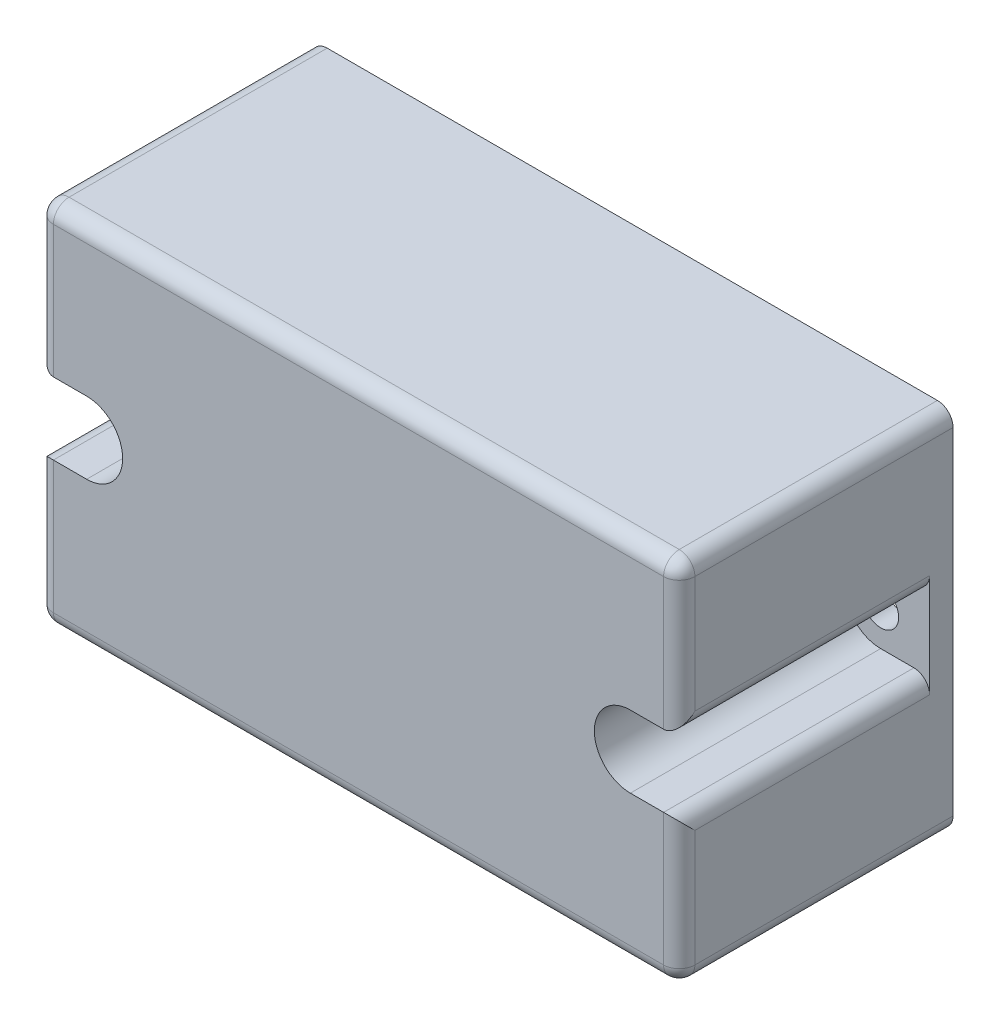
ISO-10303-21;
HEADER;
FILE_DESCRIPTION(('STEP AP214'),'2;1');
FILE_NAME('part.step','',(''),(''),'','','');
FILE_SCHEMA(('AUTOMOTIVE_DESIGN { 1 0 10303 214 1 1 1 1 }'));
ENDSEC;
DATA;
#1=APPLICATION_CONTEXT('core data for automotive mechanical design processes');
#2=APPLICATION_PROTOCOL_DEFINITION('international standard','automotive_design',2000,#1);
#3=PRODUCT_CONTEXT('',#1,'mechanical');
#4=PRODUCT('Part','Part','',(#3));
#5=PRODUCT_RELATED_PRODUCT_CATEGORY('part','',(#4));
#6=PRODUCT_DEFINITION_FORMATION('','',#4);
#7=PRODUCT_DEFINITION_CONTEXT('part definition',#1,'design');
#8=PRODUCT_DEFINITION('design','',#6,#7);
#9=PRODUCT_DEFINITION_SHAPE('','',#8);
#10=(LENGTH_UNIT() NAMED_UNIT(*) SI_UNIT(.MILLI.,.METRE.));
#11=(NAMED_UNIT(*) PLANE_ANGLE_UNIT() SI_UNIT($,.RADIAN.));
#12=(NAMED_UNIT(*) SI_UNIT($,.STERADIAN.) SOLID_ANGLE_UNIT());
#13=UNCERTAINTY_MEASURE_WITH_UNIT(LENGTH_MEASURE(1.E-05),#10,'distance_accuracy_value','');
#14=(GEOMETRIC_REPRESENTATION_CONTEXT(3) GLOBAL_UNCERTAINTY_ASSIGNED_CONTEXT((#13)) GLOBAL_UNIT_ASSIGNED_CONTEXT((#10,
#11,#12)) REPRESENTATION_CONTEXT('',''));
#15=CARTESIAN_POINT('',(0.,0.,0.));
#16=DIRECTION('',(0.,0.,1.));
#17=DIRECTION('',(1.,0.,0.));
#18=AXIS2_PLACEMENT_3D('',#15,#16,#17);
#19=CARTESIAN_POINT('',(24.9640494347916,-18.1546831961727,35.));
#20=DIRECTION('',(0.,0.,1.));
#21=DIRECTION('',(1.,0.,0.));
#22=AXIS2_PLACEMENT_3D('',#19,#20,#21);
#23=PLANE('',#22);
#24=CARTESIAN_POINT('',(-9.78595056520844,-18.1546831961727,35.));
#25=DIRECTION('',(0.,0.,-1.));
#26=DIRECTION('',(-1.,0.,0.));
#27=AXIS2_PLACEMENT_3D('',#24,#25,#26);
#28=CIRCLE('',#27,4.6);
#29=CARTESIAN_POINT('',(-9.78595056520844,-13.5546831961727,35.));
#30=VERTEX_POINT('',#29);
#31=CARTESIAN_POINT('',(-9.78595056520843,-22.7546831961727,35.));
#32=VERTEX_POINT('',#31);
#33=EDGE_CURVE('E182',#30,#32,#28,.T.);
#34=ORIENTED_EDGE('',*,*,#33,.T.);
#35=DIRECTION('',(1.,0.,0.));
#36=VECTOR('',#35,1.);
#37=CARTESIAN_POINT('',(-16.0359505652084,-22.7546831961727,35.));
#38=LINE('',#37,#36);
#39=CARTESIAN_POINT('',(-14.0359505652084,-22.7546831961727,35.));
#40=VERTEX_POINT('',#39);
#41=EDGE_CURVE('E158',#32,#40,#38,.F.);
#42=ORIENTED_EDGE('',*,*,#41,.T.);
#43=DIRECTION('',(0.,1.,0.));
#44=VECTOR('',#43,1.);
#45=CARTESIAN_POINT('',(-14.0359505652084,-29.9046831961727,35.));
#46=LINE('',#45,#44);
#47=CARTESIAN_POINT('',(-14.0359505652084,-39.6546831961727,35.));
#48=VERTEX_POINT('',#47);
#49=EDGE_CURVE('E242',#48,#40,#46,.T.);
#50=ORIENTED_EDGE('',*,*,#49,.F.);
#51=DIRECTION('',(-1.,0.,0.));
#52=VECTOR('',#51,1.);
#53=CARTESIAN_POINT('',(45.4640494347916,-39.6546831961727,35.));
#54=LINE('',#53,#52);
#55=CARTESIAN_POINT('',(63.9640494347916,-39.6546831961727,35.));
#56=VERTEX_POINT('',#55);
#57=EDGE_CURVE('E170',#56,#48,#54,.T.);
#58=ORIENTED_EDGE('',*,*,#57,.F.);
#59=DIRECTION('',(0.,-1.,0.));
#60=VECTOR('',#59,1.);
#61=CARTESIAN_POINT('',(63.9640494347916,-6.40468319617268,35.));
#62=LINE('',#61,#60);
#63=CARTESIAN_POINT('',(63.9640494347916,-22.7546831961727,35.));
#64=VERTEX_POINT('',#63);
#65=EDGE_CURVE('E516',#64,#56,#62,.T.);
#66=ORIENTED_EDGE('',*,*,#65,.F.);
#67=DIRECTION('',(1.,0.,0.));
#68=VECTOR('',#67,1.);
#69=CARTESIAN_POINT('',(59.7140494347916,-22.7546831961727,35.));
#70=LINE('',#69,#68);
#71=CARTESIAN_POINT('',(59.7140494347916,-22.7546831961727,35.));
#72=VERTEX_POINT('',#71);
#73=EDGE_CURVE('E151',#64,#72,#70,.F.);
#74=ORIENTED_EDGE('',*,*,#73,.T.);
#75=CARTESIAN_POINT('',(59.7140494347916,-18.1546831961727,35.));
#76=DIRECTION('',(0.,0.,-1.));
#77=DIRECTION('',(-1.,0.,0.));
#78=AXIS2_PLACEMENT_3D('',#75,#76,#77);
#79=CIRCLE('',#78,4.6);
#80=CARTESIAN_POINT('',(59.7140494347916,-13.5546831961727,35.));
#81=VERTEX_POINT('',#80);
#82=EDGE_CURVE('E20',#72,#81,#79,.T.);
#83=ORIENTED_EDGE('',*,*,#82,.T.);
#84=DIRECTION('',(1.,0.,0.));
#85=VECTOR('',#84,1.);
#86=CARTESIAN_POINT('',(65.9640494347916,-13.5546831961727,35.));
#87=LINE('',#86,#85);
#88=CARTESIAN_POINT('',(63.9640494347916,-13.5546831961727,35.));
#89=VERTEX_POINT('',#88);
#90=EDGE_CURVE('E148',#81,#89,#87,.T.);
#91=ORIENTED_EDGE('',*,*,#90,.T.);
#92=DIRECTION('',(0.,-1.,0.));
#93=VECTOR('',#92,1.);
#94=CARTESIAN_POINT('',(63.9640494347916,-6.40468319617268,35.));
#95=LINE('',#94,#93);
#96=CARTESIAN_POINT('',(63.9640494347916,3.34531680382732,35.));
#97=VERTEX_POINT('',#96);
#98=EDGE_CURVE('E250',#97,#89,#95,.T.);
#99=ORIENTED_EDGE('',*,*,#98,.F.);
#100=DIRECTION('',(1.,0.,0.));
#101=VECTOR('',#100,1.);
#102=CARTESIAN_POINT('',(4.46404943479156,3.34531680382732,35.));
#103=LINE('',#102,#101);
#104=CARTESIAN_POINT('',(-14.0359505652084,3.34531680382732,35.));
#105=VERTEX_POINT('',#104);
#106=EDGE_CURVE('E183',#105,#97,#103,.T.);
#107=ORIENTED_EDGE('',*,*,#106,.F.);
#108=DIRECTION('',(0.,1.,0.));
#109=VECTOR('',#108,1.);
#110=CARTESIAN_POINT('',(-14.0359505652084,-29.9046831961727,35.));
#111=LINE('',#110,#109);
#112=CARTESIAN_POINT('',(-14.0359505652084,-13.5546831961727,35.));
#113=VERTEX_POINT('',#112);
#114=EDGE_CURVE('E426',#113,#105,#111,.T.);
#115=ORIENTED_EDGE('',*,*,#114,.F.);
#116=DIRECTION('',(1.,0.,0.));
#117=VECTOR('',#116,1.);
#118=CARTESIAN_POINT('',(-9.78595056520844,-13.5546831961727,35.));
#119=LINE('',#118,#117);
#120=EDGE_CURVE('E177',#113,#30,#119,.T.);
#121=ORIENTED_EDGE('',*,*,#120,.T.);
#122=EDGE_LOOP('',(#34,#42,#50,#58,#66,#74,#83,#91,#99,#107,#115,#121));
#123=FACE_BOUND('',#122,.T.);
#124=ADVANCED_FACE('F17',(#123),#23,.T.);
#125=CARTESIAN_POINT('',(59.7140494347916,-18.1546831961727,35.));
#126=DIRECTION('',(0.,0.,-1.));
#127=DIRECTION('',(-1.,0.,0.));
#128=AXIS2_PLACEMENT_3D('',#125,#126,#127);
#129=CYLINDRICAL_SURFACE('',#128,4.6);
#130=DIRECTION('',(0.,0.,1.));
#131=VECTOR('',#130,1.);
#132=CARTESIAN_POINT('',(59.7140494347916,-13.5546831961727,35.));
#133=LINE('',#132,#131);
#134=CARTESIAN_POINT('',(59.7140494347916,-13.5546831961727,3.));
#135=VERTEX_POINT('',#134);
#136=EDGE_CURVE('E155',#135,#81,#133,.T.);
#137=ORIENTED_EDGE('',*,*,#136,.T.);
#138=ORIENTED_EDGE('',*,*,#82,.F.);
#139=DIRECTION('',(0.,0.,-1.));
#140=VECTOR('',#139,1.);
#141=CARTESIAN_POINT('',(59.7140494347916,-22.7546831961727,35.));
#142=LINE('',#141,#140);
#143=CARTESIAN_POINT('',(59.7140494347916,-22.7546831961727,3.));
#144=VERTEX_POINT('',#143);
#145=EDGE_CURVE('E163',#72,#144,#142,.T.);
#146=ORIENTED_EDGE('',*,*,#145,.T.);
#147=CARTESIAN_POINT('',(59.7140494347916,-18.1546831961727,3.));
#148=DIRECTION('',(0.,0.,-1.));
#149=DIRECTION('',(-1.,0.,0.));
#150=AXIS2_PLACEMENT_3D('',#147,#148,#149);
#151=CIRCLE('',#150,4.6);
#152=EDGE_CURVE('E162',#135,#144,#151,.F.);
#153=ORIENTED_EDGE('',*,*,#152,.F.);
#154=EDGE_LOOP('',(#137,#138,#146,#153));
#155=FACE_BOUND('',#154,.T.);
#156=ADVANCED_FACE('F161',(#155),#129,.F.);
#157=CARTESIAN_POINT('',(59.7140494347916,-22.7546831961727,35.));
#158=DIRECTION('',(0.,-1.,0.));
#159=DIRECTION('',(0.,0.,-1.));
#160=AXIS2_PLACEMENT_3D('',#157,#158,#159);
#161=PLANE('',#160);
#162=DIRECTION('',(1.,0.,0.));
#163=VECTOR('',#162,1.);
#164=CARTESIAN_POINT('',(61.3296670643506,-22.7546831961727,3.));
#165=LINE('',#164,#163);
#166=CARTESIAN_POINT('',(63.9640494347916,-22.7546831961727,3.));
#167=VERTEX_POINT('',#166);
#168=EDGE_CURVE('E230',#144,#167,#165,.T.);
#169=ORIENTED_EDGE('',*,*,#168,.F.);
#170=ORIENTED_EDGE('',*,*,#145,.F.);
#171=ORIENTED_EDGE('',*,*,#73,.F.);
#172=DIRECTION('',(0.,0.,1.));
#173=VECTOR('',#172,1.);
#174=CARTESIAN_POINT('',(63.9640494347916,-22.7546831961727,17.5));
#175=LINE('',#174,#173);
#176=EDGE_CURVE('E513',#167,#64,#175,.T.);
#177=ORIENTED_EDGE('',*,*,#176,.F.);
#178=EDGE_LOOP('',(#169,#170,#171,#177));
#179=FACE_BOUND('',#178,.T.);
#180=ADVANCED_FACE('F777',(#179),#161,.F.);
#181=CARTESIAN_POINT('',(65.9640494347916,-13.5546831961727,35.));
#182=DIRECTION('',(0.,1.,0.));
#183=DIRECTION('',(0.,0.,1.));
#184=AXIS2_PLACEMENT_3D('',#181,#182,#183);
#185=PLANE('',#184);
#186=ORIENTED_EDGE('',*,*,#90,.F.);
#187=ORIENTED_EDGE('',*,*,#136,.F.);
#188=DIRECTION('',(1.,0.,0.));
#189=VECTOR('',#188,1.);
#190=CARTESIAN_POINT('',(61.3296670643506,-13.5546831961727,3.));
#191=LINE('',#190,#189);
#192=CARTESIAN_POINT('',(63.9640494347916,-13.5546831961727,3.));
#193=VERTEX_POINT('',#192);
#194=EDGE_CURVE('E227',#193,#135,#191,.F.);
#195=ORIENTED_EDGE('',*,*,#194,.F.);
#196=DIRECTION('',(0.,0.,-1.));
#197=VECTOR('',#196,1.);
#198=CARTESIAN_POINT('',(63.9640494347916,-13.5546831961727,17.5));
#199=LINE('',#198,#197);
#200=EDGE_CURVE('E157',#89,#193,#199,.T.);
#201=ORIENTED_EDGE('',*,*,#200,.F.);
#202=EDGE_LOOP('',(#186,#187,#195,#201));
#203=FACE_BOUND('',#202,.T.);
#204=ADVANCED_FACE('F153',(#203),#185,.F.);
#205=CARTESIAN_POINT('',(-16.0359505652084,-22.7546831961727,35.));
#206=DIRECTION('',(0.,-1.,0.));
#207=DIRECTION('',(0.,0.,-1.));
#208=AXIS2_PLACEMENT_3D('',#205,#206,#207);
#209=PLANE('',#208);
#210=ORIENTED_EDGE('',*,*,#41,.F.);
#211=DIRECTION('',(0.,0.,-1.));
#212=VECTOR('',#211,1.);
#213=CARTESIAN_POINT('',(-9.78595056520843,-22.7546831961727,35.));
#214=LINE('',#213,#212);
#215=CARTESIAN_POINT('',(-9.78595056520843,-22.7546831961727,3.));
#216=VERTEX_POINT('',#215);
#217=EDGE_CURVE('E167',#32,#216,#214,.T.);
#218=ORIENTED_EDGE('',*,*,#217,.T.);
#219=DIRECTION('',(1.,0.,0.));
#220=VECTOR('',#219,1.);
#221=CARTESIAN_POINT('',(-11.4015681947675,-22.7546831961727,3.));
#222=LINE('',#221,#220);
#223=CARTESIAN_POINT('',(-14.0359505652084,-22.7546831961727,3.));
#224=VERTEX_POINT('',#223);
#225=EDGE_CURVE('E223',#224,#216,#222,.T.);
#226=ORIENTED_EDGE('',*,*,#225,.F.);
#227=DIRECTION('',(0.,0.,-1.));
#228=VECTOR('',#227,1.);
#229=CARTESIAN_POINT('',(-14.0359505652084,-22.7546831961727,17.5));
#230=LINE('',#229,#228);
#231=EDGE_CURVE('E241',#40,#224,#230,.T.);
#232=ORIENTED_EDGE('',*,*,#231,.F.);
#233=EDGE_LOOP('',(#210,#218,#226,#232));
#234=FACE_BOUND('',#233,.T.);
#235=ADVANCED_FACE('F256',(#234),#209,.F.);
#236=CARTESIAN_POINT('',(-9.78595056520844,-18.1546831961727,35.));
#237=DIRECTION('',(0.,0.,-1.));
#238=DIRECTION('',(-1.,0.,0.));
#239=AXIS2_PLACEMENT_3D('',#236,#237,#238);
#240=CYLINDRICAL_SURFACE('',#239,4.6);
#241=ORIENTED_EDGE('',*,*,#217,.F.);
#242=ORIENTED_EDGE('',*,*,#33,.F.);
#243=DIRECTION('',(0.,0.,1.));
#244=VECTOR('',#243,1.);
#245=CARTESIAN_POINT('',(-9.78595056520844,-13.5546831961727,35.));
#246=LINE('',#245,#244);
#247=CARTESIAN_POINT('',(-9.78595056520844,-13.5546831961727,3.));
#248=VERTEX_POINT('',#247);
#249=EDGE_CURVE('E174',#30,#248,#246,.F.);
#250=ORIENTED_EDGE('',*,*,#249,.T.);
#251=CARTESIAN_POINT('',(-9.78595056520844,-18.1546831961727,3.));
#252=DIRECTION('',(0.,0.,-1.));
#253=DIRECTION('',(-1.,0.,0.));
#254=AXIS2_PLACEMENT_3D('',#251,#252,#253);
#255=CIRCLE('',#254,4.6);
#256=EDGE_CURVE('E221',#216,#248,#255,.F.);
#257=ORIENTED_EDGE('',*,*,#256,.F.);
#258=EDGE_LOOP('',(#241,#242,#250,#257));
#259=FACE_BOUND('',#258,.T.);
#260=ADVANCED_FACE('F260',(#259),#240,.F.);
#261=CARTESIAN_POINT('',(-9.78595056520844,-13.5546831961727,35.));
#262=DIRECTION('',(0.,1.,0.));
#263=DIRECTION('',(0.,0.,1.));
#264=AXIS2_PLACEMENT_3D('',#261,#262,#263);
#265=PLANE('',#264);
#266=DIRECTION('',(1.,0.,0.));
#267=VECTOR('',#266,1.);
#268=CARTESIAN_POINT('',(-11.4015681947675,-13.5546831961727,3.));
#269=LINE('',#268,#267);
#270=CARTESIAN_POINT('',(-14.0359505652084,-13.5546831961727,3.));
#271=VERTEX_POINT('',#270);
#272=EDGE_CURVE('E220',#248,#271,#269,.F.);
#273=ORIENTED_EDGE('',*,*,#272,.F.);
#274=ORIENTED_EDGE('',*,*,#249,.F.);
#275=ORIENTED_EDGE('',*,*,#120,.F.);
#276=DIRECTION('',(0.,0.,1.));
#277=VECTOR('',#276,1.);
#278=CARTESIAN_POINT('',(-14.0359505652084,-13.5546831961727,17.5));
#279=LINE('',#278,#277);
#280=EDGE_CURVE('E429',#271,#113,#279,.T.);
#281=ORIENTED_EDGE('',*,*,#280,.F.);
#282=EDGE_LOOP('',(#273,#274,#275,#281));
#283=FACE_BOUND('',#282,.T.);
#284=ADVANCED_FACE('F749',(#283),#265,.F.);
#285=CARTESIAN_POINT('',(45.4640494347916,-39.6546831961727,33.));
#286=DIRECTION('',(-1.,0.,0.));
#287=DIRECTION('',(0.,-1.,0.));
#288=AXIS2_PLACEMENT_3D('',#285,#286,#287);
#289=CYLINDRICAL_SURFACE('',#288,2.);
#290=CARTESIAN_POINT('',(63.9640494347916,-39.6546831961727,33.));
#291=DIRECTION('',(1.,0.,0.));
#292=DIRECTION('',(0.,1.,0.));
#293=AXIS2_PLACEMENT_3D('',#290,#291,#292);
#294=CIRCLE('',#293,2.);
#295=CARTESIAN_POINT('',(63.9640494347916,-41.6546831961727,33.));
#296=VERTEX_POINT('',#295);
#297=EDGE_CURVE('E173',#56,#296,#294,.T.);
#298=ORIENTED_EDGE('',*,*,#297,.F.);
#299=ORIENTED_EDGE('',*,*,#57,.T.);
#300=CARTESIAN_POINT('',(-14.0359505652084,-39.6546831961727,33.));
#301=DIRECTION('',(1.,0.,0.));
#302=DIRECTION('',(0.,1.,0.));
#303=AXIS2_PLACEMENT_3D('',#300,#301,#302);
#304=CIRCLE('',#303,2.);
#305=CARTESIAN_POINT('',(-14.0359505652084,-41.6546831961727,33.));
#306=VERTEX_POINT('',#305);
#307=EDGE_CURVE('E232',#306,#48,#304,.F.);
#308=ORIENTED_EDGE('',*,*,#307,.F.);
#309=DIRECTION('',(1.,0.,0.));
#310=VECTOR('',#309,1.);
#311=CARTESIAN_POINT('',(65.9640494347916,-41.6546831961727,33.));
#312=LINE('',#311,#310);
#313=EDGE_CURVE('E217',#296,#306,#312,.F.);
#314=ORIENTED_EDGE('',*,*,#313,.F.);
#315=EDGE_LOOP('',(#298,#299,#308,#314));
#316=FACE_BOUND('',#315,.T.);
#317=ADVANCED_FACE('F372',(#316),#289,.T.);
#318=CARTESIAN_POINT('',(63.9640494347916,-39.6546831961727,33.));
#319=DIRECTION('',(1.,0.,0.));
#320=DIRECTION('',(0.,1.,0.));
#321=AXIS2_PLACEMENT_3D('',#318,#319,#320);
#322=SPHERICAL_SURFACE('',#321,2.);
#323=ORIENTED_EDGE('',*,*,#297,.T.);
#324=CARTESIAN_POINT('',(63.9640494347916,-39.6546831961727,33.));
#325=DIRECTION('',(0.,0.,1.));
#326=DIRECTION('',(1.,0.,0.));
#327=AXIS2_PLACEMENT_3D('',#324,#325,#326);
#328=CIRCLE('',#327,2.);
#329=CARTESIAN_POINT('',(65.9640494347916,-39.6546831961727,33.));
#330=VERTEX_POINT('',#329);
#331=EDGE_CURVE('E394',#330,#296,#328,.F.);
#332=ORIENTED_EDGE('',*,*,#331,.F.);
#333=CARTESIAN_POINT('',(63.9640494347916,-39.6546831961727,33.));
#334=DIRECTION('',(0.,-1.,0.));
#335=DIRECTION('',(0.,0.,-1.));
#336=AXIS2_PLACEMENT_3D('',#333,#334,#335);
#337=CIRCLE('',#336,2.);
#338=EDGE_CURVE('E247',#56,#330,#337,.F.);
#339=ORIENTED_EDGE('',*,*,#338,.F.);
#340=EDGE_LOOP('',(#323,#332,#339));
#341=FACE_BOUND('',#340,.T.);
#342=ADVANCED_FACE('F367',(#341),#322,.T.);
#343=CARTESIAN_POINT('',(63.9640494347916,-6.40468319617268,33.));
#344=DIRECTION('',(0.,-1.,0.));
#345=DIRECTION('',(0.,0.,-1.));
#346=AXIS2_PLACEMENT_3D('',#343,#344,#345);
#347=CYLINDRICAL_SURFACE('',#346,2.);
#348=ORIENTED_EDGE('',*,*,#98,.T.);
#349=CARTESIAN_POINT('',(63.9640494347916,-11.5546831961727,33.));
#350=DIRECTION('',(0.,-0.707106781186547,-0.707106781186547));
#351=DIRECTION('',(0.,0.707106781186547,-0.707106781186547));
#352=AXIS2_PLACEMENT_3D('',#349,#350,#351);
#353=ELLIPSE('',#352,2.82842712474619,2.);
#354=CARTESIAN_POINT('',(65.9640494347916,-11.5546831961727,33.));
#355=VERTEX_POINT('',#354);
#356=EDGE_CURVE('E248',#355,#89,#353,.T.);
#357=ORIENTED_EDGE('',*,*,#356,.F.);
#358=DIRECTION('',(0.,1.,0.));
#359=VECTOR('',#358,1.);
#360=CARTESIAN_POINT('',(65.9640494347916,5.34531680382732,33.));
#361=LINE('',#360,#359);
#362=CARTESIAN_POINT('',(65.9640494347916,3.34531680382732,33.));
#363=VERTEX_POINT('',#362);
#364=EDGE_CURVE('E339',#363,#355,#361,.F.);
#365=ORIENTED_EDGE('',*,*,#364,.F.);
#366=CARTESIAN_POINT('',(63.9640494347916,3.34531680382732,33.));
#367=DIRECTION('',(0.,-1.,0.));
#368=DIRECTION('',(1.,0.,0.));
#369=AXIS2_PLACEMENT_3D('',#366,#367,#368);
#370=CIRCLE('',#369,2.);
#371=EDGE_CURVE('E246',#97,#363,#370,.F.);
#372=ORIENTED_EDGE('',*,*,#371,.F.);
#373=EDGE_LOOP('',(#348,#357,#365,#372));
#374=FACE_BOUND('',#373,.T.);
#375=ADVANCED_FACE('F363',(#374),#347,.T.);
#376=CARTESIAN_POINT('',(63.9640494347916,-11.5546831961727,17.5));
#377=DIRECTION('',(0.,0.,-1.));
#378=DIRECTION('',(-1.,0.,0.));
#379=AXIS2_PLACEMENT_3D('',#376,#377,#378);
#380=CYLINDRICAL_SURFACE('',#379,2.);
#381=ORIENTED_EDGE('',*,*,#356,.T.);
#382=ORIENTED_EDGE('',*,*,#200,.T.);
#383=CARTESIAN_POINT('',(63.9640494347916,-11.5546831961727,3.));
#384=DIRECTION('',(0.,0.,-1.));
#385=DIRECTION('',(-1.,0.,0.));
#386=AXIS2_PLACEMENT_3D('',#383,#384,#385);
#387=CIRCLE('',#386,2.);
#388=CARTESIAN_POINT('',(65.9640494347916,-11.5546831961727,3.));
#389=VERTEX_POINT('',#388);
#390=EDGE_CURVE('E224',#389,#193,#387,.T.);
#391=ORIENTED_EDGE('',*,*,#390,.F.);
#392=DIRECTION('',(0.,0.,-1.));
#393=VECTOR('',#392,1.);
#394=CARTESIAN_POINT('',(65.9640494347916,-11.5546831961727,0.));
#395=LINE('',#394,#393);
#396=EDGE_CURVE('E341',#355,#389,#395,.T.);
#397=ORIENTED_EDGE('',*,*,#396,.F.);
#398=EDGE_LOOP('',(#381,#382,#391,#397));
#399=FACE_BOUND('',#398,.T.);
#400=ADVANCED_FACE('F359',(#399),#380,.T.);
#401=CARTESIAN_POINT('',(63.9640494347916,-24.7546831961727,17.5));
#402=DIRECTION('',(0.,0.,1.));
#403=DIRECTION('',(1.,0.,0.));
#404=AXIS2_PLACEMENT_3D('',#401,#402,#403);
#405=CYLINDRICAL_SURFACE('',#404,2.);
#406=CARTESIAN_POINT('',(63.9640494347916,-24.7546831961727,33.));
#407=DIRECTION('',(0.,-0.707106781186547,0.707106781186547));
#408=DIRECTION('',(0.,-0.707106781186547,-0.707106781186547));
#409=AXIS2_PLACEMENT_3D('',#406,#407,#408);
#410=ELLIPSE('',#409,2.82842712474619,2.);
#411=CARTESIAN_POINT('',(65.9640494347916,-24.7546831961727,33.));
#412=VERTEX_POINT('',#411);
#413=EDGE_CURVE('E243',#412,#64,#410,.T.);
#414=ORIENTED_EDGE('',*,*,#413,.F.);
#415=DIRECTION('',(0.,0.,-1.));
#416=VECTOR('',#415,1.);
#417=CARTESIAN_POINT('',(65.9640494347916,-24.7546831961727,0.));
#418=LINE('',#417,#416);
#419=CARTESIAN_POINT('',(65.9640494347916,-24.7546831961727,3.));
#420=VERTEX_POINT('',#419);
#421=EDGE_CURVE('E509',#420,#412,#418,.F.);
#422=ORIENTED_EDGE('',*,*,#421,.F.);
#423=CARTESIAN_POINT('',(63.9640494347916,-24.7546831961727,3.));
#424=DIRECTION('',(0.,0.,1.));
#425=DIRECTION('',(1.,0.,0.));
#426=AXIS2_PLACEMENT_3D('',#423,#424,#425);
#427=CIRCLE('',#426,2.);
#428=EDGE_CURVE('E228',#167,#420,#427,.F.);
#429=ORIENTED_EDGE('',*,*,#428,.F.);
#430=ORIENTED_EDGE('',*,*,#176,.T.);
#431=EDGE_LOOP('',(#414,#422,#429,#430));
#432=FACE_BOUND('',#431,.T.);
#433=ADVANCED_FACE('F355',(#432),#405,.T.);
#434=CARTESIAN_POINT('',(63.9640494347916,-6.40468319617268,33.));
#435=DIRECTION('',(0.,-1.,0.));
#436=DIRECTION('',(0.,0.,-1.));
#437=AXIS2_PLACEMENT_3D('',#434,#435,#436);
#438=CYLINDRICAL_SURFACE('',#437,2.);
#439=DIRECTION('',(0.,1.,0.));
#440=VECTOR('',#439,1.);
#441=CARTESIAN_POINT('',(65.9640494347916,5.34531680382732,33.));
#442=LINE('',#441,#440);
#443=EDGE_CURVE('E332',#412,#330,#442,.F.);
#444=ORIENTED_EDGE('',*,*,#443,.F.);
#445=ORIENTED_EDGE('',*,*,#413,.T.);
#446=ORIENTED_EDGE('',*,*,#65,.T.);
#447=ORIENTED_EDGE('',*,*,#338,.T.);
#448=EDGE_LOOP('',(#444,#445,#446,#447));
#449=FACE_BOUND('',#448,.T.);
#450=ADVANCED_FACE('F351',(#449),#438,.T.);
#451=CARTESIAN_POINT('',(63.9640494347916,3.34531680382732,33.));
#452=DIRECTION('',(1.,0.,0.));
#453=DIRECTION('',(0.,1.,0.));
#454=AXIS2_PLACEMENT_3D('',#451,#452,#453);
#455=SPHERICAL_SURFACE('',#454,2.);
#456=CARTESIAN_POINT('',(63.9640494347916,3.34531680382732,33.));
#457=DIRECTION('',(1.,0.,0.));
#458=DIRECTION('',(0.,0.,-1.));
#459=AXIS2_PLACEMENT_3D('',#456,#457,#458);
#460=CIRCLE('',#459,2.);
#461=CARTESIAN_POINT('',(63.9640494347916,5.34531680382732,33.));
#462=VERTEX_POINT('',#461);
#463=EDGE_CURVE('E187',#97,#462,#460,.F.);
#464=ORIENTED_EDGE('',*,*,#463,.F.);
#465=ORIENTED_EDGE('',*,*,#371,.T.);
#466=CARTESIAN_POINT('',(63.9640494347916,3.34531680382732,33.));
#467=DIRECTION('',(0.,0.,1.));
#468=DIRECTION('',(1.,0.,0.));
#469=AXIS2_PLACEMENT_3D('',#466,#467,#468);
#470=CIRCLE('',#469,2.);
#471=EDGE_CURVE('E328',#462,#363,#470,.F.);
#472=ORIENTED_EDGE('',*,*,#471,.F.);
#473=EDGE_LOOP('',(#464,#465,#472));
#474=FACE_BOUND('',#473,.T.);
#475=ADVANCED_FACE('F348',(#474),#455,.T.);
#476=CARTESIAN_POINT('',(4.46404943479156,3.34531680382732,33.));
#477=DIRECTION('',(1.,0.,0.));
#478=DIRECTION('',(0.,0.,-1.));
#479=AXIS2_PLACEMENT_3D('',#476,#477,#478);
#480=CYLINDRICAL_SURFACE('',#479,2.);
#481=CARTESIAN_POINT('',(-14.0359505652084,3.34531680382732,33.));
#482=DIRECTION('',(1.,0.,0.));
#483=DIRECTION('',(0.,1.,0.));
#484=AXIS2_PLACEMENT_3D('',#481,#482,#483);
#485=CIRCLE('',#484,2.);
#486=CARTESIAN_POINT('',(-14.0359505652084,5.34531680382732,33.));
#487=VERTEX_POINT('',#486);
#488=EDGE_CURVE('E186',#105,#487,#485,.F.);
#489=ORIENTED_EDGE('',*,*,#488,.F.);
#490=ORIENTED_EDGE('',*,*,#106,.T.);
#491=ORIENTED_EDGE('',*,*,#463,.T.);
#492=DIRECTION('',(1.,0.,0.));
#493=VECTOR('',#492,1.);
#494=CARTESIAN_POINT('',(-16.0359505652084,5.34531680382732,33.));
#495=LINE('',#494,#493);
#496=EDGE_CURVE('E446',#487,#462,#495,.T.);
#497=ORIENTED_EDGE('',*,*,#496,.F.);
#498=EDGE_LOOP('',(#489,#490,#491,#497));
#499=FACE_BOUND('',#498,.T.);
#500=ADVANCED_FACE('F316',(#499),#480,.T.);
#501=CARTESIAN_POINT('',(-14.0359505652084,3.34531680382732,33.));
#502=DIRECTION('',(1.,0.,0.));
#503=DIRECTION('',(0.,1.,0.));
#504=AXIS2_PLACEMENT_3D('',#501,#502,#503);
#505=SPHERICAL_SURFACE('',#504,2.);
#506=CARTESIAN_POINT('',(-14.0359505652084,3.34531680382732,33.));
#507=DIRECTION('',(0.,0.,1.));
#508=DIRECTION('',(1.,0.,0.));
#509=AXIS2_PLACEMENT_3D('',#506,#507,#508);
#510=CIRCLE('',#509,2.);
#511=CARTESIAN_POINT('',(-16.0359505652084,3.34531680382732,33.));
#512=VERTEX_POINT('',#511);
#513=EDGE_CURVE('E413',#512,#487,#510,.F.);
#514=ORIENTED_EDGE('',*,*,#513,.F.);
#515=CARTESIAN_POINT('',(-14.0359505652084,3.34531680382732,33.));
#516=DIRECTION('',(0.,1.,0.));
#517=DIRECTION('',(-1.,0.,0.));
#518=AXIS2_PLACEMENT_3D('',#515,#516,#517);
#519=CIRCLE('',#518,2.);
#520=EDGE_CURVE('E237',#105,#512,#519,.F.);
#521=ORIENTED_EDGE('',*,*,#520,.F.);
#522=ORIENTED_EDGE('',*,*,#488,.T.);
#523=EDGE_LOOP('',(#514,#521,#522));
#524=FACE_BOUND('',#523,.T.);
#525=ADVANCED_FACE('F311',(#524),#505,.T.);
#526=CARTESIAN_POINT('',(-14.0359505652084,-29.9046831961727,33.));
#527=DIRECTION('',(0.,1.,0.));
#528=DIRECTION('',(-1.,0.,0.));
#529=AXIS2_PLACEMENT_3D('',#526,#527,#528);
#530=CYLINDRICAL_SURFACE('',#529,2.);
#531=ORIENTED_EDGE('',*,*,#49,.T.);
#532=CARTESIAN_POINT('',(-14.0359505652084,-24.7546831961727,33.));
#533=DIRECTION('',(0.,0.707106781186547,-0.707106781186547));
#534=DIRECTION('',(0.,-0.707106781186547,-0.707106781186547));
#535=AXIS2_PLACEMENT_3D('',#532,#533,#534);
#536=ELLIPSE('',#535,2.82842712474619,2.);
#537=CARTESIAN_POINT('',(-16.0359505652084,-24.7546831961727,33.));
#538=VERTEX_POINT('',#537);
#539=EDGE_CURVE('E238',#538,#40,#536,.T.);
#540=ORIENTED_EDGE('',*,*,#539,.F.);
#541=DIRECTION('',(0.,1.,0.));
#542=VECTOR('',#541,1.);
#543=CARTESIAN_POINT('',(-16.0359505652084,-41.6546831961727,33.));
#544=LINE('',#543,#542);
#545=CARTESIAN_POINT('',(-16.0359505652084,-39.6546831961727,33.));
#546=VERTEX_POINT('',#545);
#547=EDGE_CURVE('E274',#546,#538,#544,.T.);
#548=ORIENTED_EDGE('',*,*,#547,.F.);
#549=CARTESIAN_POINT('',(-14.0359505652084,-39.6546831961727,33.));
#550=DIRECTION('',(0.,-1.,0.));
#551=DIRECTION('',(1.,0.,0.));
#552=AXIS2_PLACEMENT_3D('',#549,#550,#551);
#553=CIRCLE('',#552,2.);
#554=EDGE_CURVE('E236',#48,#546,#553,.T.);
#555=ORIENTED_EDGE('',*,*,#554,.F.);
#556=EDGE_LOOP('',(#531,#540,#548,#555));
#557=FACE_BOUND('',#556,.T.);
#558=ADVANCED_FACE('F307',(#557),#530,.T.);
#559=CARTESIAN_POINT('',(-14.0359505652084,-24.7546831961727,17.5));
#560=DIRECTION('',(0.,0.,-1.));
#561=DIRECTION('',(-1.,0.,0.));
#562=AXIS2_PLACEMENT_3D('',#559,#560,#561);
#563=CYLINDRICAL_SURFACE('',#562,2.);
#564=ORIENTED_EDGE('',*,*,#539,.T.);
#565=ORIENTED_EDGE('',*,*,#231,.T.);
#566=CARTESIAN_POINT('',(-14.0359505652084,-24.7546831961727,3.));
#567=DIRECTION('',(0.,0.,-1.));
#568=DIRECTION('',(-1.,0.,0.));
#569=AXIS2_PLACEMENT_3D('',#566,#567,#568);
#570=CIRCLE('',#569,2.);
#571=CARTESIAN_POINT('',(-16.0359505652084,-24.7546831961727,3.));
#572=VERTEX_POINT('',#571);
#573=EDGE_CURVE('E214',#572,#224,#570,.T.);
#574=ORIENTED_EDGE('',*,*,#573,.F.);
#575=DIRECTION('',(0.,0.,1.));
#576=VECTOR('',#575,1.);
#577=CARTESIAN_POINT('',(-16.0359505652084,-24.7546831961727,0.));
#578=LINE('',#577,#576);
#579=EDGE_CURVE('E276',#538,#572,#578,.F.);
#580=ORIENTED_EDGE('',*,*,#579,.F.);
#581=EDGE_LOOP('',(#564,#565,#574,#580));
#582=FACE_BOUND('',#581,.T.);
#583=ADVANCED_FACE('F303',(#582),#563,.T.);
#584=CARTESIAN_POINT('',(-14.0359505652084,-11.5546831961727,17.5));
#585=DIRECTION('',(0.,0.,1.));
#586=DIRECTION('',(1.,0.,0.));
#587=AXIS2_PLACEMENT_3D('',#584,#585,#586);
#588=CYLINDRICAL_SURFACE('',#587,2.);
#589=CARTESIAN_POINT('',(-14.0359505652084,-11.5546831961727,33.));
#590=DIRECTION('',(0.,0.707106781186547,0.707106781186547));
#591=DIRECTION('',(0.,0.707106781186547,-0.707106781186547));
#592=AXIS2_PLACEMENT_3D('',#589,#590,#591);
#593=ELLIPSE('',#592,2.82842712474619,2.);
#594=CARTESIAN_POINT('',(-16.0359505652084,-11.5546831961727,33.));
#595=VERTEX_POINT('',#594);
#596=EDGE_CURVE('E233',#595,#113,#593,.T.);
#597=ORIENTED_EDGE('',*,*,#596,.F.);
#598=DIRECTION('',(0.,0.,1.));
#599=VECTOR('',#598,1.);
#600=CARTESIAN_POINT('',(-16.0359505652084,-11.5546831961727,0.));
#601=LINE('',#600,#599);
#602=CARTESIAN_POINT('',(-16.0359505652084,-11.5546831961727,3.));
#603=VERTEX_POINT('',#602);
#604=EDGE_CURVE('E423',#603,#595,#601,.T.);
#605=ORIENTED_EDGE('',*,*,#604,.F.);
#606=CARTESIAN_POINT('',(-14.0359505652084,-11.5546831961727,3.));
#607=DIRECTION('',(0.,0.,1.));
#608=DIRECTION('',(1.,0.,0.));
#609=AXIS2_PLACEMENT_3D('',#606,#607,#608);
#610=CIRCLE('',#609,2.);
#611=EDGE_CURVE('E218',#271,#603,#610,.F.);
#612=ORIENTED_EDGE('',*,*,#611,.F.);
#613=ORIENTED_EDGE('',*,*,#280,.T.);
#614=EDGE_LOOP('',(#597,#605,#612,#613));
#615=FACE_BOUND('',#614,.T.);
#616=ADVANCED_FACE('F299',(#615),#588,.T.);
#617=CARTESIAN_POINT('',(-14.0359505652084,-29.9046831961727,33.));
#618=DIRECTION('',(0.,1.,0.));
#619=DIRECTION('',(-1.,0.,0.));
#620=AXIS2_PLACEMENT_3D('',#617,#618,#619);
#621=CYLINDRICAL_SURFACE('',#620,2.);
#622=DIRECTION('',(0.,1.,0.));
#623=VECTOR('',#622,1.);
#624=CARTESIAN_POINT('',(-16.0359505652084,-41.6546831961727,33.));
#625=LINE('',#624,#623);
#626=EDGE_CURVE('E419',#595,#512,#625,.T.);
#627=ORIENTED_EDGE('',*,*,#626,.F.);
#628=ORIENTED_EDGE('',*,*,#596,.T.);
#629=ORIENTED_EDGE('',*,*,#114,.T.);
#630=ORIENTED_EDGE('',*,*,#520,.T.);
#631=EDGE_LOOP('',(#627,#628,#629,#630));
#632=FACE_BOUND('',#631,.T.);
#633=ADVANCED_FACE('F294',(#632),#621,.T.);
#634=CARTESIAN_POINT('',(-14.0359505652084,-39.6546831961727,33.));
#635=DIRECTION('',(1.,0.,0.));
#636=DIRECTION('',(0.,1.,0.));
#637=AXIS2_PLACEMENT_3D('',#634,#635,#636);
#638=SPHERICAL_SURFACE('',#637,2.);
#639=CARTESIAN_POINT('',(-14.0359505652084,-39.6546831961727,33.));
#640=DIRECTION('',(0.,0.,1.));
#641=DIRECTION('',(1.,0.,0.));
#642=AXIS2_PLACEMENT_3D('',#639,#640,#641);
#643=CIRCLE('',#642,2.);
#644=EDGE_CURVE('E280',#306,#546,#643,.F.);
#645=ORIENTED_EDGE('',*,*,#644,.F.);
#646=ORIENTED_EDGE('',*,*,#307,.T.);
#647=ORIENTED_EDGE('',*,*,#554,.T.);
#648=EDGE_LOOP('',(#645,#646,#647));
#649=FACE_BOUND('',#648,.T.);
#650=ADVANCED_FACE('F289',(#649),#638,.T.);
#651=CARTESIAN_POINT('',(61.3296670643506,-18.1546831961727,3.));
#652=DIRECTION('',(0.,0.,1.));
#653=DIRECTION('',(1.,0.,0.));
#654=AXIS2_PLACEMENT_3D('',#651,#652,#653);
#655=PLANE('',#654);
#656=CARTESIAN_POINT('',(59.7140494347916,-18.1546831961727,3.));
#657=DIRECTION('',(0.,0.,-1.));
#658=DIRECTION('',(-1.,0.,0.));
#659=AXIS2_PLACEMENT_3D('',#656,#657,#658);
#660=CIRCLE('',#659,2.3);
#661=CARTESIAN_POINT('',(57.4140494347916,-18.1546831961727,3.));
#662=VERTEX_POINT('',#661);
#663=EDGE_CURVE('E211',#662,#662,#660,.T.);
#664=ORIENTED_EDGE('',*,*,#663,.T.);
#665=EDGE_LOOP('',(#664));
#666=FACE_BOUND('',#665,.T.);
#667=ORIENTED_EDGE('',*,*,#390,.T.);
#668=ORIENTED_EDGE('',*,*,#194,.T.);
#669=ORIENTED_EDGE('',*,*,#152,.T.);
#670=ORIENTED_EDGE('',*,*,#168,.T.);
#671=ORIENTED_EDGE('',*,*,#428,.T.);
#672=DIRECTION('',(0.,1.,0.));
#673=VECTOR('',#672,1.);
#674=CARTESIAN_POINT('',(65.9640494347916,5.34531680382732,3.));
#675=LINE('',#674,#673);
#676=EDGE_CURVE('E505',#389,#420,#675,.F.);
#677=ORIENTED_EDGE('',*,*,#676,.F.);
#678=EDGE_LOOP('',(#667,#668,#669,#670,#671,#677));
#679=FACE_BOUND('',#678,.T.);
#680=ADVANCED_FACE('F293',(#666,#679),#655,.T.);
#681=CARTESIAN_POINT('',(-11.4015681947675,-18.1546831961727,3.));
#682=DIRECTION('',(0.,0.,1.));
#683=DIRECTION('',(1.,0.,0.));
#684=AXIS2_PLACEMENT_3D('',#681,#682,#683);
#685=PLANE('',#684);
#686=CARTESIAN_POINT('',(-9.78595056520844,-18.1546831961727,3.));
#687=DIRECTION('',(0.,0.,-1.));
#688=DIRECTION('',(-1.,0.,0.));
#689=AXIS2_PLACEMENT_3D('',#686,#687,#688);
#690=CIRCLE('',#689,2.3);
#691=CARTESIAN_POINT('',(-12.0859505652084,-18.1546831961727,3.));
#692=VERTEX_POINT('',#691);
#693=EDGE_CURVE('E208',#692,#692,#690,.T.);
#694=ORIENTED_EDGE('',*,*,#693,.T.);
#695=EDGE_LOOP('',(#694));
#696=FACE_BOUND('',#695,.T.);
#697=DIRECTION('',(0.,1.,0.));
#698=VECTOR('',#697,1.);
#699=CARTESIAN_POINT('',(-16.0359505652084,-41.6546831961727,3.));
#700=LINE('',#699,#698);
#701=EDGE_CURVE('E433',#572,#603,#700,.T.);
#702=ORIENTED_EDGE('',*,*,#701,.F.);
#703=ORIENTED_EDGE('',*,*,#573,.T.);
#704=ORIENTED_EDGE('',*,*,#225,.T.);
#705=ORIENTED_EDGE('',*,*,#256,.T.);
#706=ORIENTED_EDGE('',*,*,#272,.T.);
#707=ORIENTED_EDGE('',*,*,#611,.T.);
#708=EDGE_LOOP('',(#702,#703,#704,#705,#706,#707));
#709=FACE_BOUND('',#708,.T.);
#710=ADVANCED_FACE('F265',(#696,#709),#685,.T.);
#711=CARTESIAN_POINT('',(65.9640494347916,-41.6546831961727,0.));
#712=DIRECTION('',(0.,-1.,0.));
#713=DIRECTION('',(0.,0.,-1.));
#714=AXIS2_PLACEMENT_3D('',#711,#712,#713);
#715=PLANE('',#714);
#716=DIRECTION('',(0.,0.,1.));
#717=VECTOR('',#716,1.);
#718=CARTESIAN_POINT('',(63.9640494347916,-41.6546831961727,0.));
#719=LINE('',#718,#717);
#720=CARTESIAN_POINT('',(63.9640494347916,-41.6546831961727,0.));
#721=VERTEX_POINT('',#720);
#722=EDGE_CURVE('E395',#296,#721,#719,.F.);
#723=ORIENTED_EDGE('',*,*,#722,.F.);
#724=ORIENTED_EDGE('',*,*,#313,.T.);
#725=DIRECTION('',(0.,0.,1.));
#726=VECTOR('',#725,1.);
#727=CARTESIAN_POINT('',(-14.0359505652084,-41.6546831961727,0.));
#728=LINE('',#727,#726);
#729=CARTESIAN_POINT('',(-14.0359505652084,-41.6546831961727,0.));
#730=VERTEX_POINT('',#729);
#731=EDGE_CURVE('E282',#730,#306,#728,.T.);
#732=ORIENTED_EDGE('',*,*,#731,.F.);
#733=DIRECTION('',(1.,0.,0.));
#734=VECTOR('',#733,1.);
#735=CARTESIAN_POINT('',(24.9640494347916,-41.6546831961727,0.));
#736=LINE('',#735,#734);
#737=EDGE_CURVE('E207',#730,#721,#736,.T.);
#738=ORIENTED_EDGE('',*,*,#737,.T.);
#739=EDGE_LOOP('',(#723,#724,#732,#738));
#740=FACE_BOUND('',#739,.T.);
#741=ADVANCED_FACE('F480',(#740),#715,.T.);
#742=CARTESIAN_POINT('',(63.9640494347916,-39.6546831961727,0.));
#743=DIRECTION('',(0.,0.,1.));
#744=DIRECTION('',(1.,0.,0.));
#745=AXIS2_PLACEMENT_3D('',#742,#743,#744);
#746=CYLINDRICAL_SURFACE('',#745,2.);
#747=ORIENTED_EDGE('',*,*,#331,.T.);
#748=ORIENTED_EDGE('',*,*,#722,.T.);
#749=CARTESIAN_POINT('',(63.9640494347916,-39.6546831961727,0.));
#750=DIRECTION('',(0.,0.,1.));
#751=DIRECTION('',(1.,0.,0.));
#752=AXIS2_PLACEMENT_3D('',#749,#750,#751);
#753=CIRCLE('',#752,2.);
#754=CARTESIAN_POINT('',(65.9640494347916,-39.6546831961727,0.));
#755=VERTEX_POINT('',#754);
#756=EDGE_CURVE('E204',#721,#755,#753,.T.);
#757=ORIENTED_EDGE('',*,*,#756,.T.);
#758=DIRECTION('',(0.,0.,-1.));
#759=VECTOR('',#758,1.);
#760=CARTESIAN_POINT('',(65.9640494347916,-39.6546831961727,0.));
#761=LINE('',#760,#759);
#762=EDGE_CURVE('E342',#330,#755,#761,.T.);
#763=ORIENTED_EDGE('',*,*,#762,.F.);
#764=EDGE_LOOP('',(#747,#748,#757,#763));
#765=FACE_BOUND('',#764,.T.);
#766=ADVANCED_FACE('F479',(#765),#746,.T.);
#767=CARTESIAN_POINT('',(65.9640494347916,5.34531680382732,0.));
#768=DIRECTION('',(1.,0.,0.));
#769=DIRECTION('',(0.,0.,-1.));
#770=AXIS2_PLACEMENT_3D('',#767,#768,#769);
#771=PLANE('',#770);
#772=ORIENTED_EDGE('',*,*,#421,.T.);
#773=ORIENTED_EDGE('',*,*,#443,.T.);
#774=ORIENTED_EDGE('',*,*,#762,.T.);
#775=DIRECTION('',(0.,1.,0.));
#776=VECTOR('',#775,1.);
#777=CARTESIAN_POINT('',(65.9640494347916,-18.1546831961727,0.));
#778=LINE('',#777,#776);
#779=CARTESIAN_POINT('',(65.9640494347916,3.34531680382732,0.));
#780=VERTEX_POINT('',#779);
#781=EDGE_CURVE('E203',#755,#780,#778,.T.);
#782=ORIENTED_EDGE('',*,*,#781,.T.);
#783=DIRECTION('',(0.,0.,1.));
#784=VECTOR('',#783,1.);
#785=CARTESIAN_POINT('',(65.9640494347916,3.34531680382732,0.));
#786=LINE('',#785,#784);
#787=EDGE_CURVE('E331',#363,#780,#786,.F.);
#788=ORIENTED_EDGE('',*,*,#787,.F.);
#789=ORIENTED_EDGE('',*,*,#364,.T.);
#790=ORIENTED_EDGE('',*,*,#396,.T.);
#791=ORIENTED_EDGE('',*,*,#676,.T.);
#792=EDGE_LOOP('',(#772,#773,#774,#782,#788,#789,#790,#791));
#793=FACE_BOUND('',#792,.T.);
#794=ADVANCED_FACE('F470',(#793),#771,.T.);
#795=CARTESIAN_POINT('',(63.9640494347916,3.34531680382732,0.));
#796=DIRECTION('',(0.,0.,1.));
#797=DIRECTION('',(1.,0.,0.));
#798=AXIS2_PLACEMENT_3D('',#795,#796,#797);
#799=CYLINDRICAL_SURFACE('',#798,2.);
#800=ORIENTED_EDGE('',*,*,#471,.T.);
#801=ORIENTED_EDGE('',*,*,#787,.T.);
#802=CARTESIAN_POINT('',(63.9640494347916,3.34531680382732,0.));
#803=DIRECTION('',(0.,0.,1.));
#804=DIRECTION('',(1.,0.,0.));
#805=AXIS2_PLACEMENT_3D('',#802,#803,#804);
#806=CIRCLE('',#805,2.);
#807=CARTESIAN_POINT('',(63.9640494347916,5.34531680382732,0.));
#808=VERTEX_POINT('',#807);
#809=EDGE_CURVE('E200',#780,#808,#806,.T.);
#810=ORIENTED_EDGE('',*,*,#809,.T.);
#811=DIRECTION('',(0.,0.,1.));
#812=VECTOR('',#811,1.);
#813=CARTESIAN_POINT('',(63.9640494347916,5.34531680382732,0.));
#814=LINE('',#813,#812);
#815=EDGE_CURVE('E416',#462,#808,#814,.F.);
#816=ORIENTED_EDGE('',*,*,#815,.F.);
#817=EDGE_LOOP('',(#800,#801,#810,#816));
#818=FACE_BOUND('',#817,.T.);
#819=ADVANCED_FACE('F500',(#818),#799,.T.);
#820=CARTESIAN_POINT('',(-16.0359505652084,5.34531680382732,0.));
#821=DIRECTION('',(0.,1.,0.));
#822=DIRECTION('',(0.,0.,1.));
#823=AXIS2_PLACEMENT_3D('',#820,#821,#822);
#824=PLANE('',#823);
#825=ORIENTED_EDGE('',*,*,#815,.T.);
#826=DIRECTION('',(1.,0.,0.));
#827=VECTOR('',#826,1.);
#828=CARTESIAN_POINT('',(24.9640494347916,5.34531680382732,0.));
#829=LINE('',#828,#827);
#830=CARTESIAN_POINT('',(-14.0359505652084,5.34531680382732,0.));
#831=VERTEX_POINT('',#830);
#832=EDGE_CURVE('E199',#808,#831,#829,.F.);
#833=ORIENTED_EDGE('',*,*,#832,.T.);
#834=DIRECTION('',(0.,0.,1.));
#835=VECTOR('',#834,1.);
#836=CARTESIAN_POINT('',(-14.0359505652084,5.34531680382732,0.));
#837=LINE('',#836,#835);
#838=EDGE_CURVE('E277',#487,#831,#837,.F.);
#839=ORIENTED_EDGE('',*,*,#838,.F.);
#840=ORIENTED_EDGE('',*,*,#496,.T.);
#841=EDGE_LOOP('',(#825,#833,#839,#840));
#842=FACE_BOUND('',#841,.T.);
#843=ADVANCED_FACE('F560',(#842),#824,.T.);
#844=CARTESIAN_POINT('',(-14.0359505652084,3.34531680382732,0.));
#845=DIRECTION('',(0.,0.,1.));
#846=DIRECTION('',(1.,0.,0.));
#847=AXIS2_PLACEMENT_3D('',#844,#845,#846);
#848=CYLINDRICAL_SURFACE('',#847,2.);
#849=ORIENTED_EDGE('',*,*,#513,.T.);
#850=ORIENTED_EDGE('',*,*,#838,.T.);
#851=CARTESIAN_POINT('',(-14.0359505652084,3.34531680382732,0.));
#852=DIRECTION('',(0.,0.,1.));
#853=DIRECTION('',(1.,0.,0.));
#854=AXIS2_PLACEMENT_3D('',#851,#852,#853);
#855=CIRCLE('',#854,2.);
#856=CARTESIAN_POINT('',(-16.0359505652084,3.34531680382732,0.));
#857=VERTEX_POINT('',#856);
#858=EDGE_CURVE('E196',#831,#857,#855,.T.);
#859=ORIENTED_EDGE('',*,*,#858,.T.);
#860=DIRECTION('',(0.,0.,1.));
#861=VECTOR('',#860,1.);
#862=CARTESIAN_POINT('',(-16.0359505652084,3.34531680382732,0.));
#863=LINE('',#862,#861);
#864=EDGE_CURVE('E422',#512,#857,#863,.F.);
#865=ORIENTED_EDGE('',*,*,#864,.F.);
#866=EDGE_LOOP('',(#849,#850,#859,#865));
#867=FACE_BOUND('',#866,.T.);
#868=ADVANCED_FACE('F556',(#867),#848,.T.);
#869=CARTESIAN_POINT('',(-16.0359505652084,-41.6546831961727,0.));
#870=DIRECTION('',(-1.,0.,0.));
#871=DIRECTION('',(0.,0.,1.));
#872=AXIS2_PLACEMENT_3D('',#869,#870,#871);
#873=PLANE('',#872);
#874=ORIENTED_EDGE('',*,*,#864,.T.);
#875=DIRECTION('',(0.,1.,0.));
#876=VECTOR('',#875,1.);
#877=CARTESIAN_POINT('',(-16.0359505652084,-18.1546831961727,0.));
#878=LINE('',#877,#876);
#879=CARTESIAN_POINT('',(-16.0359505652084,-39.6546831961727,0.));
#880=VERTEX_POINT('',#879);
#881=EDGE_CURVE('E195',#857,#880,#878,.F.);
#882=ORIENTED_EDGE('',*,*,#881,.T.);
#883=DIRECTION('',(0.,0.,1.));
#884=VECTOR('',#883,1.);
#885=CARTESIAN_POINT('',(-16.0359505652084,-39.6546831961727,0.));
#886=LINE('',#885,#884);
#887=EDGE_CURVE('E35',#546,#880,#886,.F.);
#888=ORIENTED_EDGE('',*,*,#887,.F.);
#889=ORIENTED_EDGE('',*,*,#547,.T.);
#890=ORIENTED_EDGE('',*,*,#579,.T.);
#891=ORIENTED_EDGE('',*,*,#701,.T.);
#892=ORIENTED_EDGE('',*,*,#604,.T.);
#893=ORIENTED_EDGE('',*,*,#626,.T.);
#894=EDGE_LOOP('',(#874,#882,#888,#889,#890,#891,#892,#893));
#895=FACE_BOUND('',#894,.T.);
#896=ADVANCED_FACE('F540',(#895),#873,.T.);
#897=CARTESIAN_POINT('',(-14.0359505652084,-39.6546831961727,0.));
#898=DIRECTION('',(0.,0.,1.));
#899=DIRECTION('',(1.,0.,0.));
#900=AXIS2_PLACEMENT_3D('',#897,#898,#899);
#901=CYLINDRICAL_SURFACE('',#900,2.);
#902=ORIENTED_EDGE('',*,*,#644,.T.);
#903=ORIENTED_EDGE('',*,*,#887,.T.);
#904=CARTESIAN_POINT('',(-14.0359505652084,-39.6546831961727,0.));
#905=DIRECTION('',(0.,0.,1.));
#906=DIRECTION('',(1.,0.,0.));
#907=AXIS2_PLACEMENT_3D('',#904,#905,#906);
#908=CIRCLE('',#907,2.);
#909=EDGE_CURVE('E193',#880,#730,#908,.T.);
#910=ORIENTED_EDGE('',*,*,#909,.T.);
#911=ORIENTED_EDGE('',*,*,#731,.T.);
#912=EDGE_LOOP('',(#902,#903,#910,#911));
#913=FACE_BOUND('',#912,.T.);
#914=ADVANCED_FACE('F534',(#913),#901,.T.);
#915=CARTESIAN_POINT('',(59.7140494347916,-18.1546831961727,35.));
#916=DIRECTION('',(0.,0.,-1.));
#917=DIRECTION('',(-1.,0.,0.));
#918=AXIS2_PLACEMENT_3D('',#915,#916,#917);
#919=CYLINDRICAL_SURFACE('',#918,2.3);
#920=CARTESIAN_POINT('',(59.7140494347916,-18.1546831961727,0.));
#921=DIRECTION('',(0.,0.,-1.));
#922=DIRECTION('',(-1.,0.,0.));
#923=AXIS2_PLACEMENT_3D('',#920,#921,#922);
#924=CIRCLE('',#923,2.3);
#925=CARTESIAN_POINT('',(57.4140494347916,-18.1546831961727,0.));
#926=VERTEX_POINT('',#925);
#927=EDGE_CURVE('E26',#926,#926,#924,.T.);
#928=ORIENTED_EDGE('',*,*,#927,.T.);
#929=EDGE_LOOP('',(#928));
#930=FACE_BOUND('',#929,.T.);
#931=ORIENTED_EDGE('',*,*,#663,.F.);
#932=EDGE_LOOP('',(#931));
#933=FACE_BOUND('',#932,.T.);
#934=ADVANCED_FACE('F579',(#930,#933),#919,.F.);
#935=CARTESIAN_POINT('',(-9.78595056520844,-18.1546831961727,35.));
#936=DIRECTION('',(0.,0.,-1.));
#937=DIRECTION('',(-1.,0.,0.));
#938=AXIS2_PLACEMENT_3D('',#935,#936,#937);
#939=CYLINDRICAL_SURFACE('',#938,2.3);
#940=CARTESIAN_POINT('',(-9.78595056520844,-18.1546831961727,0.));
#941=DIRECTION('',(0.,0.,-1.));
#942=DIRECTION('',(-1.,0.,0.));
#943=AXIS2_PLACEMENT_3D('',#940,#941,#942);
#944=CIRCLE('',#943,2.3);
#945=CARTESIAN_POINT('',(-12.0859505652084,-18.1546831961727,0.));
#946=VERTEX_POINT('',#945);
#947=EDGE_CURVE('E11',#946,#946,#944,.T.);
#948=ORIENTED_EDGE('',*,*,#947,.T.);
#949=EDGE_LOOP('',(#948));
#950=FACE_BOUND('',#949,.T.);
#951=ORIENTED_EDGE('',*,*,#693,.F.);
#952=EDGE_LOOP('',(#951));
#953=FACE_BOUND('',#952,.T.);
#954=ADVANCED_FACE('F573',(#950,#953),#939,.F.);
#955=CARTESIAN_POINT('',(24.9640494347916,-18.1546831961727,0.));
#956=DIRECTION('',(0.,0.,1.));
#957=DIRECTION('',(1.,0.,0.));
#958=AXIS2_PLACEMENT_3D('',#955,#956,#957);
#959=PLANE('',#958);
#960=ORIENTED_EDGE('',*,*,#947,.F.);
#961=EDGE_LOOP('',(#960));
#962=FACE_BOUND('',#961,.T.);
#963=ORIENTED_EDGE('',*,*,#927,.F.);
#964=EDGE_LOOP('',(#963));
#965=FACE_BOUND('',#964,.T.);
#966=ORIENTED_EDGE('',*,*,#881,.F.);
#967=ORIENTED_EDGE('',*,*,#858,.F.);
#968=ORIENTED_EDGE('',*,*,#832,.F.);
#969=ORIENTED_EDGE('',*,*,#809,.F.);
#970=ORIENTED_EDGE('',*,*,#781,.F.);
#971=ORIENTED_EDGE('',*,*,#756,.F.);
#972=ORIENTED_EDGE('',*,*,#737,.F.);
#973=ORIENTED_EDGE('',*,*,#909,.F.);
#974=EDGE_LOOP('',(#966,#967,#968,#969,#970,#971,#972,#973));
#975=FACE_BOUND('',#974,.T.);
#976=ADVANCED_FACE('F475',(#962,#965,#975),#959,.F.);
#977=CLOSED_SHELL('',(#124,#156,#180,#204,#235,#260,#284,#317,#342,#375,#400,#433,#450,#475,
#500,#525,#558,#583,#616,#633,#650,#680,#710,#741,#766,#794,#819,#843,#868,#896,#914,#934,#954,#976));
#978=MANIFOLD_SOLID_BREP('B1',#977);
#979=ADVANCED_BREP_SHAPE_REPRESENTATION('',(#18,#978),#14);
#980=SHAPE_DEFINITION_REPRESENTATION(#9,#979);
ENDSEC;
END-ISO-10303-21;
